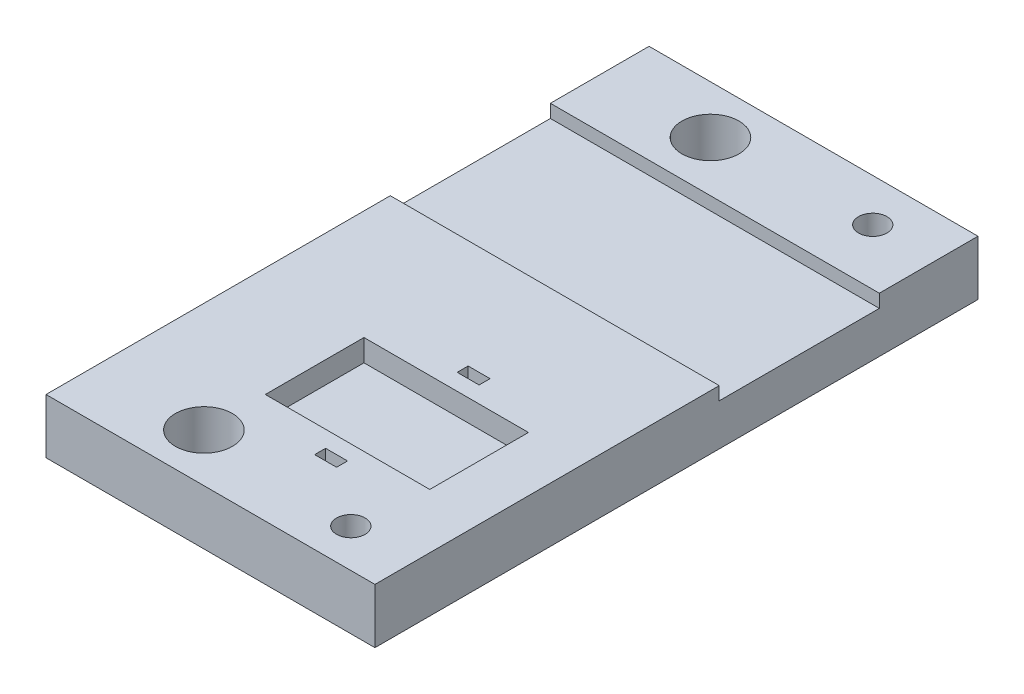
ISO-10303-21;
HEADER;
FILE_DESCRIPTION(('STEP AP214'),'2;1');
FILE_NAME('part.step','',(''),(''),'','','');
FILE_SCHEMA(('AUTOMOTIVE_DESIGN { 1 0 10303 214 1 1 1 1 }'));
ENDSEC;
DATA;
#1=APPLICATION_CONTEXT('core data for automotive mechanical design processes');
#2=APPLICATION_PROTOCOL_DEFINITION('international standard','automotive_design',2000,#1);
#3=PRODUCT_CONTEXT('',#1,'mechanical');
#4=PRODUCT('Part','Part','',(#3));
#5=PRODUCT_RELATED_PRODUCT_CATEGORY('part','',(#4));
#6=PRODUCT_DEFINITION_FORMATION('','',#4);
#7=PRODUCT_DEFINITION_CONTEXT('part definition',#1,'design');
#8=PRODUCT_DEFINITION('design','',#6,#7);
#9=PRODUCT_DEFINITION_SHAPE('','',#8);
#10=(LENGTH_UNIT() NAMED_UNIT(*) SI_UNIT(.MILLI.,.METRE.));
#11=(NAMED_UNIT(*) PLANE_ANGLE_UNIT() SI_UNIT($,.RADIAN.));
#12=(NAMED_UNIT(*) SI_UNIT($,.STERADIAN.) SOLID_ANGLE_UNIT());
#13=UNCERTAINTY_MEASURE_WITH_UNIT(LENGTH_MEASURE(1.E-05),#10,'distance_accuracy_value','');
#14=(GEOMETRIC_REPRESENTATION_CONTEXT(3) GLOBAL_UNCERTAINTY_ASSIGNED_CONTEXT((#13)) GLOBAL_UNIT_ASSIGNED_CONTEXT((#10,
#11,#12)) REPRESENTATION_CONTEXT('',''));
#15=CARTESIAN_POINT('',(0.,0.,0.));
#16=DIRECTION('',(0.,0.,1.));
#17=DIRECTION('',(1.,0.,0.));
#18=AXIS2_PLACEMENT_3D('',#15,#16,#17);
#19=CARTESIAN_POINT('',(0.,6.35,0.));
#20=DIRECTION('',(0.,1.,0.));
#21=DIRECTION('',(0.,0.,1.));
#22=AXIS2_PLACEMENT_3D('',#19,#20,#21);
#23=PLANE('',#22);
#24=DIRECTION('',(-1.,0.,0.));
#25=VECTOR('',#24,1.);
#26=CARTESIAN_POINT('',(-12.7,6.35,-52.832));
#27=LINE('',#26,#25);
#28=CARTESIAN_POINT('',(25.4,6.35,-52.832));
#29=VERTEX_POINT('',#28);
#30=CARTESIAN_POINT('',(-12.7,6.35,-52.832));
#31=VERTEX_POINT('',#30);
#32=EDGE_CURVE('E191',#29,#31,#27,.T.);
#33=ORIENTED_EDGE('',*,*,#32,.F.);
#34=DIRECTION('',(0.,0.,1.));
#35=VECTOR('',#34,1.);
#36=CARTESIAN_POINT('',(25.4,6.35,0.));
#37=LINE('',#36,#35);
#38=CARTESIAN_POINT('',(25.4,6.35,-64.262));
#39=VERTEX_POINT('',#38);
#40=EDGE_CURVE('E309',#39,#29,#37,.T.);
#41=ORIENTED_EDGE('',*,*,#40,.F.);
#42=DIRECTION('',(1.,0.,0.));
#43=VECTOR('',#42,1.);
#44=CARTESIAN_POINT('',(0.,6.35,-64.262));
#45=LINE('',#44,#43);
#46=CARTESIAN_POINT('',(-12.7,6.35,-64.262));
#47=VERTEX_POINT('',#46);
#48=EDGE_CURVE('E312',#47,#39,#45,.T.);
#49=ORIENTED_EDGE('',*,*,#48,.F.);
#50=DIRECTION('',(0.,0.,1.));
#51=VECTOR('',#50,1.);
#52=CARTESIAN_POINT('',(-12.7,6.35,0.));
#53=LINE('',#52,#51);
#54=EDGE_CURVE('E315',#47,#31,#53,.T.);
#55=ORIENTED_EDGE('',*,*,#54,.T.);
#56=EDGE_LOOP('',(#33,#41,#49,#55));
#57=FACE_BOUND('',#56,.T.);
#58=CARTESIAN_POINT('',(0.,6.35,-58.674));
#59=DIRECTION('',(0.,1.,0.));
#60=DIRECTION('',(0.,0.,1.));
#61=AXIS2_PLACEMENT_3D('',#58,#59,#60);
#62=CIRCLE('',#61,3.302);
#63=CARTESIAN_POINT('',(0.,6.35,-55.372));
#64=VERTEX_POINT('',#63);
#65=EDGE_CURVE('E302',#64,#64,#62,.T.);
#66=ORIENTED_EDGE('',*,*,#65,.F.);
#67=EDGE_LOOP('',(#66));
#68=FACE_BOUND('',#67,.T.);
#69=CARTESIAN_POINT('',(18.161,6.35,-59.309));
#70=DIRECTION('',(0.,1.,0.));
#71=DIRECTION('',(0.,0.,1.));
#72=AXIS2_PLACEMENT_3D('',#69,#70,#71);
#73=CIRCLE('',#72,1.651);
#74=CARTESIAN_POINT('',(18.161,6.35,-57.658));
#75=VERTEX_POINT('',#74);
#76=EDGE_CURVE('E298',#75,#75,#73,.T.);
#77=ORIENTED_EDGE('',*,*,#76,.F.);
#78=EDGE_LOOP('',(#77));
#79=FACE_BOUND('',#78,.T.);
#80=ADVANCED_FACE('F39',(#57,#68,#79),#23,.T.);
#81=CARTESIAN_POINT('',(8.89,0.,-5.20699999999998));
#82=DIRECTION('',(0.,0.,-1.));
#83=DIRECTION('',(-1.,0.,0.));
#84=AXIS2_PLACEMENT_3D('',#81,#82,#83);
#85=PLANE('',#84);
#86=DIRECTION('',(-1.,0.,0.));
#87=VECTOR('',#86,1.);
#88=CARTESIAN_POINT('',(8.89,1.016,-5.20699999999998));
#89=LINE('',#88,#87);
#90=CARTESIAN_POINT('',(11.43,1.016,-5.20699999999998));
#91=VERTEX_POINT('',#90);
#92=CARTESIAN_POINT('',(8.89,1.016,-5.20699999999998));
#93=VERTEX_POINT('',#92);
#94=EDGE_CURVE('E209',#91,#93,#89,.T.);
#95=ORIENTED_EDGE('',*,*,#94,.F.);
#96=DIRECTION('',(0.,1.,0.));
#97=VECTOR('',#96,1.);
#98=CARTESIAN_POINT('',(11.43,0.,-5.20699999999998));
#99=LINE('',#98,#97);
#100=CARTESIAN_POINT('',(11.43,6.35,-5.20699999999998));
#101=VERTEX_POINT('',#100);
#102=EDGE_CURVE('E239',#91,#101,#99,.T.);
#103=ORIENTED_EDGE('',*,*,#102,.T.);
#104=DIRECTION('',(-1.,0.,0.));
#105=VECTOR('',#104,1.);
#106=CARTESIAN_POINT('',(0.,6.35,-5.20699999999998));
#107=LINE('',#106,#105);
#108=CARTESIAN_POINT('',(8.89,6.35,-5.20699999999998));
#109=VERTEX_POINT('',#108);
#110=EDGE_CURVE('E244',#101,#109,#107,.T.);
#111=ORIENTED_EDGE('',*,*,#110,.T.);
#112=DIRECTION('',(0.,1.,0.));
#113=VECTOR('',#112,1.);
#114=CARTESIAN_POINT('',(8.89,0.,-5.20699999999998));
#115=LINE('',#114,#113);
#116=EDGE_CURVE('E237',#93,#109,#115,.T.);
#117=ORIENTED_EDGE('',*,*,#116,.F.);
#118=EDGE_LOOP('',(#95,#103,#111,#117));
#119=FACE_BOUND('',#118,.T.);
#120=ADVANCED_FACE('F379',(#119),#85,.F.);
#121=CARTESIAN_POINT('',(8.89,0.,-20.447));
#122=DIRECTION('',(0.,0.,1.));
#123=DIRECTION('',(1.,0.,0.));
#124=AXIS2_PLACEMENT_3D('',#121,#122,#123);
#125=PLANE('',#124);
#126=DIRECTION('',(1.,0.,0.));
#127=VECTOR('',#126,1.);
#128=CARTESIAN_POINT('',(8.89,1.016,-20.447));
#129=LINE('',#128,#127);
#130=CARTESIAN_POINT('',(8.89,1.016,-20.447));
#131=VERTEX_POINT('',#130);
#132=CARTESIAN_POINT('',(11.43,1.016,-20.447));
#133=VERTEX_POINT('',#132);
#134=EDGE_CURVE('E204',#131,#133,#129,.T.);
#135=ORIENTED_EDGE('',*,*,#134,.F.);
#136=DIRECTION('',(0.,1.,0.));
#137=VECTOR('',#136,1.);
#138=CARTESIAN_POINT('',(8.89,0.,-20.447));
#139=LINE('',#138,#137);
#140=CARTESIAN_POINT('',(8.89,6.35,-20.447));
#141=VERTEX_POINT('',#140);
#142=EDGE_CURVE('E221',#131,#141,#139,.T.);
#143=ORIENTED_EDGE('',*,*,#142,.T.);
#144=DIRECTION('',(1.,0.,0.));
#145=VECTOR('',#144,1.);
#146=CARTESIAN_POINT('',(0.,6.35,-20.447));
#147=LINE('',#146,#145);
#148=CARTESIAN_POINT('',(11.43,6.35,-20.447));
#149=VERTEX_POINT('',#148);
#150=EDGE_CURVE('E252',#141,#149,#147,.T.);
#151=ORIENTED_EDGE('',*,*,#150,.T.);
#152=DIRECTION('',(0.,1.,0.));
#153=VECTOR('',#152,1.);
#154=CARTESIAN_POINT('',(11.43,0.,-20.447));
#155=LINE('',#154,#153);
#156=EDGE_CURVE('E229',#133,#149,#155,.T.);
#157=ORIENTED_EDGE('',*,*,#156,.F.);
#158=EDGE_LOOP('',(#135,#143,#151,#157));
#159=FACE_BOUND('',#158,.T.);
#160=ADVANCED_FACE('F414',(#159),#125,.F.);
#161=CARTESIAN_POINT('',(25.4,6.35,0.));
#162=DIRECTION('',(1.,0.,0.));
#163=DIRECTION('',(0.,0.,-1.));
#164=AXIS2_PLACEMENT_3D('',#161,#162,#163);
#165=PLANE('',#164);
#166=DIRECTION('',(0.,1.,0.));
#167=VECTOR('',#166,1.);
#168=CARTESIAN_POINT('',(25.4,4.826,-52.832));
#169=LINE('',#168,#167);
#170=CARTESIAN_POINT('',(25.4,4.826,-52.832));
#171=VERTEX_POINT('',#170);
#172=EDGE_CURVE('E198',#171,#29,#169,.T.);
#173=ORIENTED_EDGE('',*,*,#172,.F.);
#174=DIRECTION('',(0.,0.,-1.));
#175=VECTOR('',#174,1.);
#176=CARTESIAN_POINT('',(25.4,4.826,-52.832));
#177=LINE('',#176,#175);
#178=CARTESIAN_POINT('',(25.4,4.826,-34.29));
#179=VERTEX_POINT('',#178);
#180=EDGE_CURVE('E181',#179,#171,#177,.T.);
#181=ORIENTED_EDGE('',*,*,#180,.F.);
#182=DIRECTION('',(0.,1.,0.));
#183=VECTOR('',#182,1.);
#184=CARTESIAN_POINT('',(25.4,4.826,-34.29));
#185=LINE('',#184,#183);
#186=CARTESIAN_POINT('',(25.4,6.35,-34.29));
#187=VERTEX_POINT('',#186);
#188=EDGE_CURVE('E178',#179,#187,#185,.T.);
#189=ORIENTED_EDGE('',*,*,#188,.T.);
#190=CARTESIAN_POINT('',(25.4,6.35,5.58800000000001));
#191=VERTEX_POINT('',#190);
#192=EDGE_CURVE('E308',#187,#191,#37,.T.);
#193=ORIENTED_EDGE('',*,*,#192,.T.);
#194=DIRECTION('',(0.,-1.,0.));
#195=VECTOR('',#194,1.);
#196=CARTESIAN_POINT('',(25.4,6.35,5.58800000000001));
#197=LINE('',#196,#195);
#198=CARTESIAN_POINT('',(25.4,0.,5.58800000000001));
#199=VERTEX_POINT('',#198);
#200=EDGE_CURVE('E321',#191,#199,#197,.T.);
#201=ORIENTED_EDGE('',*,*,#200,.T.);
#202=DIRECTION('',(0.,0.,1.));
#203=VECTOR('',#202,1.);
#204=CARTESIAN_POINT('',(25.4,0.,0.));
#205=LINE('',#204,#203);
#206=CARTESIAN_POINT('',(25.4,0.,-64.262));
#207=VERTEX_POINT('',#206);
#208=EDGE_CURVE('E333',#207,#199,#205,.T.);
#209=ORIENTED_EDGE('',*,*,#208,.F.);
#210=DIRECTION('',(0.,-1.,0.));
#211=VECTOR('',#210,1.);
#212=CARTESIAN_POINT('',(25.4,6.35,-64.262));
#213=LINE('',#212,#211);
#214=EDGE_CURVE('E11',#39,#207,#213,.T.);
#215=ORIENTED_EDGE('',*,*,#214,.F.);
#216=ORIENTED_EDGE('',*,*,#40,.T.);
#217=EDGE_LOOP('',(#173,#181,#189,#193,#201,#209,#215,#216));
#218=FACE_BOUND('',#217,.T.);
#219=ADVANCED_FACE('F359',(#218),#165,.T.);
#220=CARTESIAN_POINT('',(0.,6.35,-64.262));
#221=DIRECTION('',(0.,0.,-1.));
#222=DIRECTION('',(-1.,0.,0.));
#223=AXIS2_PLACEMENT_3D('',#220,#221,#222);
#224=PLANE('',#223);
#225=DIRECTION('',(1.,0.,0.));
#226=VECTOR('',#225,1.);
#227=CARTESIAN_POINT('',(0.,0.,-64.262));
#228=LINE('',#227,#226);
#229=CARTESIAN_POINT('',(-12.7,0.,-64.262));
#230=VERTEX_POINT('',#229);
#231=EDGE_CURVE('E336',#230,#207,#228,.T.);
#232=ORIENTED_EDGE('',*,*,#231,.F.);
#233=DIRECTION('',(0.,-1.,0.));
#234=VECTOR('',#233,1.);
#235=CARTESIAN_POINT('',(-12.7,6.35,-64.262));
#236=LINE('',#235,#234);
#237=EDGE_CURVE('E47',#47,#230,#236,.T.);
#238=ORIENTED_EDGE('',*,*,#237,.F.);
#239=ORIENTED_EDGE('',*,*,#48,.T.);
#240=ORIENTED_EDGE('',*,*,#214,.T.);
#241=EDGE_LOOP('',(#232,#238,#239,#240));
#242=FACE_BOUND('',#241,.T.);
#243=ADVANCED_FACE('F354',(#242),#224,.T.);
#244=CARTESIAN_POINT('',(-12.7,6.35,0.));
#245=DIRECTION('',(1.,0.,0.));
#246=DIRECTION('',(0.,0.,-1.));
#247=AXIS2_PLACEMENT_3D('',#244,#245,#246);
#248=PLANE('',#247);
#249=DIRECTION('',(0.,0.,1.));
#250=VECTOR('',#249,1.);
#251=CARTESIAN_POINT('',(-12.7,4.826,-52.832));
#252=LINE('',#251,#250);
#253=CARTESIAN_POINT('',(-12.7,4.826,-52.832));
#254=VERTEX_POINT('',#253);
#255=CARTESIAN_POINT('',(-12.7,4.826,-34.29));
#256=VERTEX_POINT('',#255);
#257=EDGE_CURVE('E182',#254,#256,#252,.T.);
#258=ORIENTED_EDGE('',*,*,#257,.F.);
#259=DIRECTION('',(0.,1.,0.));
#260=VECTOR('',#259,1.);
#261=CARTESIAN_POINT('',(-12.7,4.826,-52.832));
#262=LINE('',#261,#260);
#263=EDGE_CURVE('E205',#254,#31,#262,.T.);
#264=ORIENTED_EDGE('',*,*,#263,.T.);
#265=ORIENTED_EDGE('',*,*,#54,.F.);
#266=ORIENTED_EDGE('',*,*,#237,.T.);
#267=DIRECTION('',(0.,0.,1.));
#268=VECTOR('',#267,1.);
#269=CARTESIAN_POINT('',(-12.7,0.,0.));
#270=LINE('',#269,#268);
#271=CARTESIAN_POINT('',(-12.7,0.,5.58800000000001));
#272=VERTEX_POINT('',#271);
#273=EDGE_CURVE('E339',#230,#272,#270,.T.);
#274=ORIENTED_EDGE('',*,*,#273,.T.);
#275=DIRECTION('',(0.,-1.,0.));
#276=VECTOR('',#275,1.);
#277=CARTESIAN_POINT('',(-12.7,6.35,5.58800000000001));
#278=LINE('',#277,#276);
#279=CARTESIAN_POINT('',(-12.7,6.35,5.58800000000001));
#280=VERTEX_POINT('',#279);
#281=EDGE_CURVE('E345',#280,#272,#278,.T.);
#282=ORIENTED_EDGE('',*,*,#281,.F.);
#283=CARTESIAN_POINT('',(-12.7,6.35,-34.29));
#284=VERTEX_POINT('',#283);
#285=EDGE_CURVE('E196',#284,#280,#53,.T.);
#286=ORIENTED_EDGE('',*,*,#285,.F.);
#287=DIRECTION('',(0.,1.,0.));
#288=VECTOR('',#287,1.);
#289=CARTESIAN_POINT('',(-12.7,4.826,-34.29));
#290=LINE('',#289,#288);
#291=EDGE_CURVE('E54',#256,#284,#290,.T.);
#292=ORIENTED_EDGE('',*,*,#291,.F.);
#293=EDGE_LOOP('',(#258,#264,#265,#266,#274,#282,#286,#292));
#294=FACE_BOUND('',#293,.T.);
#295=ADVANCED_FACE('F194',(#294),#248,.F.);
#296=CARTESIAN_POINT('',(0.,6.35,0.));
#297=DIRECTION('',(0.,-1.,0.));
#298=DIRECTION('',(0.,0.,-1.));
#299=AXIS2_PLACEMENT_3D('',#296,#297,#298);
#300=CYLINDRICAL_SURFACE('',#299,3.302);
#301=CARTESIAN_POINT('',(0.,6.35,0.));
#302=DIRECTION('',(0.,1.,0.));
#303=DIRECTION('',(0.,0.,1.));
#304=AXIS2_PLACEMENT_3D('',#301,#302,#303);
#305=CIRCLE('',#304,3.302);
#306=CARTESIAN_POINT('',(0.,6.35,3.302));
#307=VERTEX_POINT('',#306);
#308=EDGE_CURVE('E305',#307,#307,#305,.T.);
#309=ORIENTED_EDGE('',*,*,#308,.T.);
#310=EDGE_LOOP('',(#309));
#311=FACE_BOUND('',#310,.T.);
#312=CARTESIAN_POINT('',(0.,0.,0.));
#313=DIRECTION('',(0.,1.,0.));
#314=DIRECTION('',(0.,0.,1.));
#315=AXIS2_PLACEMENT_3D('',#312,#313,#314);
#316=CIRCLE('',#315,3.302);
#317=CARTESIAN_POINT('',(0.,0.,3.302));
#318=VERTEX_POINT('',#317);
#319=EDGE_CURVE('E330',#318,#318,#316,.T.);
#320=ORIENTED_EDGE('',*,*,#319,.F.);
#321=EDGE_LOOP('',(#320));
#322=FACE_BOUND('',#321,.T.);
#323=ADVANCED_FACE('F400',(#311,#322),#300,.F.);
#324=CARTESIAN_POINT('',(0.,6.35,-58.674));
#325=DIRECTION('',(0.,-1.,0.));
#326=DIRECTION('',(0.,0.,-1.));
#327=AXIS2_PLACEMENT_3D('',#324,#325,#326);
#328=CYLINDRICAL_SURFACE('',#327,3.302);
#329=ORIENTED_EDGE('',*,*,#65,.T.);
#330=EDGE_LOOP('',(#329));
#331=FACE_BOUND('',#330,.T.);
#332=CARTESIAN_POINT('',(0.,0.,-58.674));
#333=DIRECTION('',(0.,1.,0.));
#334=DIRECTION('',(0.,0.,1.));
#335=AXIS2_PLACEMENT_3D('',#332,#333,#334);
#336=CIRCLE('',#335,3.302);
#337=CARTESIAN_POINT('',(0.,0.,-55.372));
#338=VERTEX_POINT('',#337);
#339=EDGE_CURVE('E327',#338,#338,#336,.T.);
#340=ORIENTED_EDGE('',*,*,#339,.F.);
#341=EDGE_LOOP('',(#340));
#342=FACE_BOUND('',#341,.T.);
#343=ADVANCED_FACE('F388',(#331,#342),#328,.F.);
#344=CARTESIAN_POINT('',(18.161,6.35,-59.309));
#345=DIRECTION('',(0.,-1.,0.));
#346=DIRECTION('',(0.,0.,-1.));
#347=AXIS2_PLACEMENT_3D('',#344,#345,#346);
#348=CYLINDRICAL_SURFACE('',#347,1.651);
#349=ORIENTED_EDGE('',*,*,#76,.T.);
#350=EDGE_LOOP('',(#349));
#351=FACE_BOUND('',#350,.T.);
#352=CARTESIAN_POINT('',(18.161,0.,-59.309));
#353=DIRECTION('',(0.,1.,0.));
#354=DIRECTION('',(0.,0.,1.));
#355=AXIS2_PLACEMENT_3D('',#352,#353,#354);
#356=CIRCLE('',#355,1.651);
#357=CARTESIAN_POINT('',(18.161,0.,-57.658));
#358=VERTEX_POINT('',#357);
#359=EDGE_CURVE('E324',#358,#358,#356,.T.);
#360=ORIENTED_EDGE('',*,*,#359,.F.);
#361=EDGE_LOOP('',(#360));
#362=FACE_BOUND('',#361,.T.);
#363=ADVANCED_FACE('F385',(#351,#362),#348,.F.);
#364=CARTESIAN_POINT('',(18.161,6.35,1.14300000000001));
#365=DIRECTION('',(0.,-1.,0.));
#366=DIRECTION('',(0.,0.,-1.));
#367=AXIS2_PLACEMENT_3D('',#364,#365,#366);
#368=CYLINDRICAL_SURFACE('',#367,1.651);
#369=CARTESIAN_POINT('',(18.161,6.35,1.14300000000001));
#370=DIRECTION('',(0.,1.,0.));
#371=DIRECTION('',(0.,0.,1.));
#372=AXIS2_PLACEMENT_3D('',#369,#370,#371);
#373=CIRCLE('',#372,1.651);
#374=CARTESIAN_POINT('',(18.161,6.35,2.79400000000001));
#375=VERTEX_POINT('',#374);
#376=EDGE_CURVE('E295',#375,#375,#373,.T.);
#377=ORIENTED_EDGE('',*,*,#376,.T.);
#378=EDGE_LOOP('',(#377));
#379=FACE_BOUND('',#378,.T.);
#380=CARTESIAN_POINT('',(18.161,0.,1.14300000000001));
#381=DIRECTION('',(0.,1.,0.));
#382=DIRECTION('',(0.,0.,1.));
#383=AXIS2_PLACEMENT_3D('',#380,#381,#382);
#384=CIRCLE('',#383,1.651);
#385=CARTESIAN_POINT('',(18.161,0.,2.79400000000001));
#386=VERTEX_POINT('',#385);
#387=EDGE_CURVE('E288',#386,#386,#384,.T.);
#388=ORIENTED_EDGE('',*,*,#387,.F.);
#389=EDGE_LOOP('',(#388));
#390=FACE_BOUND('',#389,.T.);
#391=ADVANCED_FACE('F41',(#379,#390),#368,.F.);
#392=CARTESIAN_POINT('',(0.,6.35,5.58800000000001));
#393=DIRECTION('',(0.,0.,-1.));
#394=DIRECTION('',(-1.,0.,0.));
#395=AXIS2_PLACEMENT_3D('',#392,#393,#394);
#396=PLANE('',#395);
#397=DIRECTION('',(1.,0.,0.));
#398=VECTOR('',#397,1.);
#399=CARTESIAN_POINT('',(0.,0.,5.58800000000001));
#400=LINE('',#399,#398);
#401=EDGE_CURVE('E299',#272,#199,#400,.T.);
#402=ORIENTED_EDGE('',*,*,#401,.T.);
#403=ORIENTED_EDGE('',*,*,#200,.F.);
#404=DIRECTION('',(1.,0.,0.));
#405=VECTOR('',#404,1.);
#406=CARTESIAN_POINT('',(0.,6.35,5.58800000000001));
#407=LINE('',#406,#405);
#408=EDGE_CURVE('E318',#280,#191,#407,.T.);
#409=ORIENTED_EDGE('',*,*,#408,.F.);
#410=ORIENTED_EDGE('',*,*,#281,.T.);
#411=EDGE_LOOP('',(#402,#403,#409,#410));
#412=FACE_BOUND('',#411,.T.);
#413=ADVANCED_FACE('F364',(#412),#396,.F.);
#414=DIRECTION('',(1.,0.,0.));
#415=VECTOR('',#414,1.);
#416=CARTESIAN_POINT('',(-12.7,6.35,-34.29));
#417=LINE('',#416,#415);
#418=EDGE_CURVE('E368',#284,#187,#417,.T.);
#419=ORIENTED_EDGE('',*,*,#418,.F.);
#420=ORIENTED_EDGE('',*,*,#285,.T.);
#421=ORIENTED_EDGE('',*,*,#408,.T.);
#422=ORIENTED_EDGE('',*,*,#192,.F.);
#423=EDGE_LOOP('',(#419,#420,#421,#422));
#424=FACE_BOUND('',#423,.T.);
#425=DIRECTION('',(0.,0.,1.));
#426=VECTOR('',#425,1.);
#427=CARTESIAN_POINT('',(8.89,6.35,0.));
#428=LINE('',#427,#426);
#429=CARTESIAN_POINT('',(8.89,6.35,-21.717));
#430=VERTEX_POINT('',#429);
#431=EDGE_CURVE('E259',#430,#141,#428,.T.);
#432=ORIENTED_EDGE('',*,*,#431,.F.);
#433=DIRECTION('',(-1.,0.,0.));
#434=VECTOR('',#433,1.);
#435=CARTESIAN_POINT('',(0.,6.35,-21.717));
#436=LINE('',#435,#434);
#437=CARTESIAN_POINT('',(11.43,6.35,-21.717));
#438=VERTEX_POINT('',#437);
#439=EDGE_CURVE('E257',#438,#430,#436,.T.);
#440=ORIENTED_EDGE('',*,*,#439,.F.);
#441=DIRECTION('',(0.,0.,-1.));
#442=VECTOR('',#441,1.);
#443=CARTESIAN_POINT('',(11.43,6.35,0.));
#444=LINE('',#443,#442);
#445=EDGE_CURVE('E255',#149,#438,#444,.T.);
#446=ORIENTED_EDGE('',*,*,#445,.F.);
#447=ORIENTED_EDGE('',*,*,#150,.F.);
#448=EDGE_LOOP('',(#432,#440,#446,#447));
#449=FACE_BOUND('',#448,.T.);
#450=DIRECTION('',(1.,0.,0.));
#451=VECTOR('',#450,1.);
#452=CARTESIAN_POINT('',(0.,6.35,-3.93699999999998));
#453=LINE('',#452,#451);
#454=CARTESIAN_POINT('',(8.89,6.35,-3.93699999999998));
#455=VERTEX_POINT('',#454);
#456=CARTESIAN_POINT('',(11.43,6.35,-3.93699999999998));
#457=VERTEX_POINT('',#456);
#458=EDGE_CURVE('E249',#455,#457,#453,.T.);
#459=ORIENTED_EDGE('',*,*,#458,.F.);
#460=DIRECTION('',(0.,0.,1.));
#461=VECTOR('',#460,1.);
#462=CARTESIAN_POINT('',(8.89,6.35,0.));
#463=LINE('',#462,#461);
#464=EDGE_CURVE('E247',#109,#455,#463,.T.);
#465=ORIENTED_EDGE('',*,*,#464,.F.);
#466=ORIENTED_EDGE('',*,*,#110,.F.);
#467=DIRECTION('',(0.,0.,-1.));
#468=VECTOR('',#467,1.);
#469=CARTESIAN_POINT('',(11.43,6.35,0.));
#470=LINE('',#469,#468);
#471=EDGE_CURVE('E225',#457,#101,#470,.T.);
#472=ORIENTED_EDGE('',*,*,#471,.F.);
#473=EDGE_LOOP('',(#459,#465,#466,#472));
#474=FACE_BOUND('',#473,.T.);
#475=DIRECTION('',(0.,0.,1.));
#476=VECTOR('',#475,1.);
#477=CARTESIAN_POINT('',(0.,6.35,-18.542));
#478=LINE('',#477,#476);
#479=CARTESIAN_POINT('',(0.,6.35,-18.542));
#480=VERTEX_POINT('',#479);
#481=CARTESIAN_POINT('',(0.,6.35,-7.11199999999998));
#482=VERTEX_POINT('',#481);
#483=EDGE_CURVE('E262',#480,#482,#478,.T.);
#484=ORIENTED_EDGE('',*,*,#483,.F.);
#485=DIRECTION('',(-1.,0.,0.));
#486=VECTOR('',#485,1.);
#487=CARTESIAN_POINT('',(0.,6.35,-18.542));
#488=LINE('',#487,#486);
#489=CARTESIAN_POINT('',(19.05,6.35,-18.542));
#490=VERTEX_POINT('',#489);
#491=EDGE_CURVE('E267',#490,#480,#488,.T.);
#492=ORIENTED_EDGE('',*,*,#491,.F.);
#493=DIRECTION('',(0.,0.,-1.));
#494=VECTOR('',#493,1.);
#495=CARTESIAN_POINT('',(19.05,6.35,-18.542));
#496=LINE('',#495,#494);
#497=CARTESIAN_POINT('',(19.05,6.35,-7.11199999999998));
#498=VERTEX_POINT('',#497);
#499=EDGE_CURVE('E281',#498,#490,#496,.T.);
#500=ORIENTED_EDGE('',*,*,#499,.F.);
#501=DIRECTION('',(1.,0.,0.));
#502=VECTOR('',#501,1.);
#503=CARTESIAN_POINT('',(0.,6.35,-7.11199999999998));
#504=LINE('',#503,#502);
#505=EDGE_CURVE('E278',#482,#498,#504,.T.);
#506=ORIENTED_EDGE('',*,*,#505,.F.);
#507=EDGE_LOOP('',(#484,#492,#500,#506));
#508=FACE_BOUND('',#507,.T.);
#509=ORIENTED_EDGE('',*,*,#376,.F.);
#510=EDGE_LOOP('',(#509));
#511=FACE_BOUND('',#510,.T.);
#512=ORIENTED_EDGE('',*,*,#308,.F.);
#513=EDGE_LOOP('',(#512));
#514=FACE_BOUND('',#513,.T.);
#515=ADVANCED_FACE('F366',(#424,#449,#474,#508,#511,#514),#23,.T.);
#516=CARTESIAN_POINT('',(0.,0.,0.));
#517=DIRECTION('',(0.,1.,0.));
#518=DIRECTION('',(0.,0.,1.));
#519=AXIS2_PLACEMENT_3D('',#516,#517,#518);
#520=PLANE('',#519);
#521=DIRECTION('',(0.,0.,1.));
#522=VECTOR('',#521,1.);
#523=CARTESIAN_POINT('',(8.89,0.,-20.447));
#524=LINE('',#523,#522);
#525=CARTESIAN_POINT('',(8.89,0.,-21.717));
#526=VERTEX_POINT('',#525);
#527=CARTESIAN_POINT('',(8.89,0.,-3.93699999999998));
#528=VERTEX_POINT('',#527);
#529=EDGE_CURVE('E212',#526,#528,#524,.T.);
#530=ORIENTED_EDGE('',*,*,#529,.T.);
#531=DIRECTION('',(1.,0.,0.));
#532=VECTOR('',#531,1.);
#533=CARTESIAN_POINT('',(8.89,0.,-3.93699999999998));
#534=LINE('',#533,#532);
#535=CARTESIAN_POINT('',(11.43,0.,-3.93699999999998));
#536=VERTEX_POINT('',#535);
#537=EDGE_CURVE('E211',#528,#536,#534,.T.);
#538=ORIENTED_EDGE('',*,*,#537,.T.);
#539=DIRECTION('',(0.,0.,-1.));
#540=VECTOR('',#539,1.);
#541=CARTESIAN_POINT('',(11.43,0.,-20.447));
#542=LINE('',#541,#540);
#543=CARTESIAN_POINT('',(11.43,0.,-21.717));
#544=VERTEX_POINT('',#543);
#545=EDGE_CURVE('E214',#536,#544,#542,.T.);
#546=ORIENTED_EDGE('',*,*,#545,.T.);
#547=DIRECTION('',(-1.,0.,0.));
#548=VECTOR('',#547,1.);
#549=CARTESIAN_POINT('',(8.89,0.,-21.717));
#550=LINE('',#549,#548);
#551=EDGE_CURVE('E218',#544,#526,#550,.T.);
#552=ORIENTED_EDGE('',*,*,#551,.T.);
#553=EDGE_LOOP('',(#530,#538,#546,#552));
#554=FACE_BOUND('',#553,.T.);
#555=ORIENTED_EDGE('',*,*,#387,.T.);
#556=EDGE_LOOP('',(#555));
#557=FACE_BOUND('',#556,.T.);
#558=ORIENTED_EDGE('',*,*,#359,.T.);
#559=EDGE_LOOP('',(#558));
#560=FACE_BOUND('',#559,.T.);
#561=ORIENTED_EDGE('',*,*,#339,.T.);
#562=EDGE_LOOP('',(#561));
#563=FACE_BOUND('',#562,.T.);
#564=ORIENTED_EDGE('',*,*,#319,.T.);
#565=EDGE_LOOP('',(#564));
#566=FACE_BOUND('',#565,.T.);
#567=ORIENTED_EDGE('',*,*,#208,.T.);
#568=ORIENTED_EDGE('',*,*,#401,.F.);
#569=ORIENTED_EDGE('',*,*,#273,.F.);
#570=ORIENTED_EDGE('',*,*,#231,.T.);
#571=EDGE_LOOP('',(#567,#568,#569,#570));
#572=FACE_BOUND('',#571,.T.);
#573=ADVANCED_FACE('F353',(#554,#557,#560,#563,#566,#572),#520,.F.);
#574=CARTESIAN_POINT('',(0.,3.81,-18.542));
#575=DIRECTION('',(-1.,0.,0.));
#576=DIRECTION('',(0.,0.,1.));
#577=AXIS2_PLACEMENT_3D('',#574,#575,#576);
#578=PLANE('',#577);
#579=ORIENTED_EDGE('',*,*,#483,.T.);
#580=DIRECTION('',(0.,1.,0.));
#581=VECTOR('',#580,1.);
#582=CARTESIAN_POINT('',(0.,3.81,-7.11199999999998));
#583=LINE('',#582,#581);
#584=CARTESIAN_POINT('',(0.,3.81,-7.11199999999998));
#585=VERTEX_POINT('',#584);
#586=EDGE_CURVE('E276',#585,#482,#583,.T.);
#587=ORIENTED_EDGE('',*,*,#586,.F.);
#588=DIRECTION('',(0.,0.,1.));
#589=VECTOR('',#588,1.);
#590=CARTESIAN_POINT('',(0.,3.81,-18.542));
#591=LINE('',#590,#589);
#592=CARTESIAN_POINT('',(0.,3.81,-18.542));
#593=VERTEX_POINT('',#592);
#594=EDGE_CURVE('E263',#593,#585,#591,.T.);
#595=ORIENTED_EDGE('',*,*,#594,.F.);
#596=DIRECTION('',(0.,1.,0.));
#597=VECTOR('',#596,1.);
#598=CARTESIAN_POINT('',(0.,3.81,-18.542));
#599=LINE('',#598,#597);
#600=EDGE_CURVE('E286',#593,#480,#599,.T.);
#601=ORIENTED_EDGE('',*,*,#600,.T.);
#602=EDGE_LOOP('',(#579,#587,#595,#601));
#603=FACE_BOUND('',#602,.T.);
#604=ADVANCED_FACE('F393',(#603),#578,.F.);
#605=CARTESIAN_POINT('',(0.,3.81,-18.542));
#606=DIRECTION('',(0.,0.,-1.));
#607=DIRECTION('',(-1.,0.,0.));
#608=AXIS2_PLACEMENT_3D('',#605,#606,#607);
#609=PLANE('',#608);
#610=ORIENTED_EDGE('',*,*,#491,.T.);
#611=ORIENTED_EDGE('',*,*,#600,.F.);
#612=DIRECTION('',(-1.,0.,0.));
#613=VECTOR('',#612,1.);
#614=CARTESIAN_POINT('',(0.,3.81,-18.542));
#615=LINE('',#614,#613);
#616=CARTESIAN_POINT('',(19.05,3.81,-18.542));
#617=VERTEX_POINT('',#616);
#618=EDGE_CURVE('E273',#617,#593,#615,.T.);
#619=ORIENTED_EDGE('',*,*,#618,.F.);
#620=DIRECTION('',(0.,1.,0.));
#621=VECTOR('',#620,1.);
#622=CARTESIAN_POINT('',(19.05,3.81,-18.542));
#623=LINE('',#622,#621);
#624=EDGE_CURVE('E289',#617,#490,#623,.T.);
#625=ORIENTED_EDGE('',*,*,#624,.T.);
#626=EDGE_LOOP('',(#610,#611,#619,#625));
#627=FACE_BOUND('',#626,.T.);
#628=ADVANCED_FACE('F422',(#627),#609,.F.);
#629=CARTESIAN_POINT('',(19.05,3.81,-18.542));
#630=DIRECTION('',(1.,0.,0.));
#631=DIRECTION('',(0.,0.,-1.));
#632=AXIS2_PLACEMENT_3D('',#629,#630,#631);
#633=PLANE('',#632);
#634=ORIENTED_EDGE('',*,*,#499,.T.);
#635=ORIENTED_EDGE('',*,*,#624,.F.);
#636=DIRECTION('',(0.,0.,-1.));
#637=VECTOR('',#636,1.);
#638=CARTESIAN_POINT('',(19.05,3.81,-18.542));
#639=LINE('',#638,#637);
#640=CARTESIAN_POINT('',(19.05,3.81,-7.11199999999998));
#641=VERTEX_POINT('',#640);
#642=EDGE_CURVE('E270',#641,#617,#639,.T.);
#643=ORIENTED_EDGE('',*,*,#642,.F.);
#644=DIRECTION('',(0.,1.,0.));
#645=VECTOR('',#644,1.);
#646=CARTESIAN_POINT('',(19.05,3.81,-7.11199999999998));
#647=LINE('',#646,#645);
#648=EDGE_CURVE('E291',#641,#498,#647,.T.);
#649=ORIENTED_EDGE('',*,*,#648,.T.);
#650=EDGE_LOOP('',(#634,#635,#643,#649));
#651=FACE_BOUND('',#650,.T.);
#652=ADVANCED_FACE('F428',(#651),#633,.F.);
#653=CARTESIAN_POINT('',(0.,3.81,-7.11199999999998));
#654=DIRECTION('',(0.,0.,1.));
#655=DIRECTION('',(1.,0.,0.));
#656=AXIS2_PLACEMENT_3D('',#653,#654,#655);
#657=PLANE('',#656);
#658=ORIENTED_EDGE('',*,*,#505,.T.);
#659=ORIENTED_EDGE('',*,*,#648,.F.);
#660=DIRECTION('',(1.,0.,0.));
#661=VECTOR('',#660,1.);
#662=CARTESIAN_POINT('',(0.,3.81,-7.11199999999998));
#663=LINE('',#662,#661);
#664=EDGE_CURVE('E266',#585,#641,#663,.T.);
#665=ORIENTED_EDGE('',*,*,#664,.F.);
#666=ORIENTED_EDGE('',*,*,#586,.T.);
#667=EDGE_LOOP('',(#658,#659,#665,#666));
#668=FACE_BOUND('',#667,.T.);
#669=ADVANCED_FACE('F424',(#668),#657,.F.);
#670=CARTESIAN_POINT('',(0.,3.81,0.));
#671=DIRECTION('',(0.,1.,0.));
#672=DIRECTION('',(0.,0.,1.));
#673=AXIS2_PLACEMENT_3D('',#670,#671,#672);
#674=PLANE('',#673);
#675=ORIENTED_EDGE('',*,*,#594,.T.);
#676=ORIENTED_EDGE('',*,*,#664,.T.);
#677=ORIENTED_EDGE('',*,*,#642,.T.);
#678=ORIENTED_EDGE('',*,*,#618,.T.);
#679=EDGE_LOOP('',(#675,#676,#677,#678));
#680=FACE_BOUND('',#679,.T.);
#681=ADVANCED_FACE('F427',(#680),#674,.T.);
#682=CARTESIAN_POINT('',(8.89,0.,-3.93699999999998));
#683=DIRECTION('',(0.,0.,1.));
#684=DIRECTION('',(1.,0.,0.));
#685=AXIS2_PLACEMENT_3D('',#682,#683,#684);
#686=PLANE('',#685);
#687=ORIENTED_EDGE('',*,*,#458,.T.);
#688=DIRECTION('',(0.,1.,0.));
#689=VECTOR('',#688,1.);
#690=CARTESIAN_POINT('',(11.43,0.,-3.93699999999998));
#691=LINE('',#690,#689);
#692=EDGE_CURVE('E234',#536,#457,#691,.T.);
#693=ORIENTED_EDGE('',*,*,#692,.F.);
#694=ORIENTED_EDGE('',*,*,#537,.F.);
#695=DIRECTION('',(0.,1.,0.));
#696=VECTOR('',#695,1.);
#697=CARTESIAN_POINT('',(8.89,0.,-3.93699999999998));
#698=LINE('',#697,#696);
#699=EDGE_CURVE('E215',#528,#455,#698,.T.);
#700=ORIENTED_EDGE('',*,*,#699,.T.);
#701=EDGE_LOOP('',(#687,#693,#694,#700));
#702=FACE_BOUND('',#701,.T.);
#703=ADVANCED_FACE('F438',(#702),#686,.F.);
#704=CARTESIAN_POINT('',(8.89,0.,-20.447));
#705=DIRECTION('',(-1.,0.,0.));
#706=DIRECTION('',(0.,0.,1.));
#707=AXIS2_PLACEMENT_3D('',#704,#705,#706);
#708=PLANE('',#707);
#709=ORIENTED_EDGE('',*,*,#431,.T.);
#710=ORIENTED_EDGE('',*,*,#142,.F.);
#711=DIRECTION('',(0.,0.,-1.));
#712=VECTOR('',#711,1.);
#713=CARTESIAN_POINT('',(8.89,1.016,-5.20699999999998));
#714=LINE('',#713,#712);
#715=EDGE_CURVE('E62',#93,#131,#714,.T.);
#716=ORIENTED_EDGE('',*,*,#715,.F.);
#717=ORIENTED_EDGE('',*,*,#116,.T.);
#718=ORIENTED_EDGE('',*,*,#464,.T.);
#719=ORIENTED_EDGE('',*,*,#699,.F.);
#720=ORIENTED_EDGE('',*,*,#529,.F.);
#721=DIRECTION('',(0.,1.,0.));
#722=VECTOR('',#721,1.);
#723=CARTESIAN_POINT('',(8.89,0.,-21.717));
#724=LINE('',#723,#722);
#725=EDGE_CURVE('E222',#526,#430,#724,.T.);
#726=ORIENTED_EDGE('',*,*,#725,.T.);
#727=EDGE_LOOP('',(#709,#710,#716,#717,#718,#719,#720,#726));
#728=FACE_BOUND('',#727,.T.);
#729=ADVANCED_FACE('F442',(#728),#708,.F.);
#730=CARTESIAN_POINT('',(8.89,0.,-21.717));
#731=DIRECTION('',(0.,0.,-1.));
#732=DIRECTION('',(-1.,0.,0.));
#733=AXIS2_PLACEMENT_3D('',#730,#731,#732);
#734=PLANE('',#733);
#735=ORIENTED_EDGE('',*,*,#439,.T.);
#736=ORIENTED_EDGE('',*,*,#725,.F.);
#737=ORIENTED_EDGE('',*,*,#551,.F.);
#738=DIRECTION('',(0.,1.,0.));
#739=VECTOR('',#738,1.);
#740=CARTESIAN_POINT('',(11.43,0.,-21.717));
#741=LINE('',#740,#739);
#742=EDGE_CURVE('E226',#544,#438,#741,.T.);
#743=ORIENTED_EDGE('',*,*,#742,.T.);
#744=EDGE_LOOP('',(#735,#736,#737,#743));
#745=FACE_BOUND('',#744,.T.);
#746=ADVANCED_FACE('F449',(#745),#734,.F.);
#747=CARTESIAN_POINT('',(11.43,0.,-20.447));
#748=DIRECTION('',(1.,0.,0.));
#749=DIRECTION('',(0.,0.,-1.));
#750=AXIS2_PLACEMENT_3D('',#747,#748,#749);
#751=PLANE('',#750);
#752=ORIENTED_EDGE('',*,*,#445,.T.);
#753=ORIENTED_EDGE('',*,*,#742,.F.);
#754=ORIENTED_EDGE('',*,*,#545,.F.);
#755=ORIENTED_EDGE('',*,*,#692,.T.);
#756=ORIENTED_EDGE('',*,*,#471,.T.);
#757=ORIENTED_EDGE('',*,*,#102,.F.);
#758=DIRECTION('',(0.,0.,1.));
#759=VECTOR('',#758,1.);
#760=CARTESIAN_POINT('',(11.43,1.016,-5.20699999999998));
#761=LINE('',#760,#759);
#762=EDGE_CURVE('E207',#133,#91,#761,.T.);
#763=ORIENTED_EDGE('',*,*,#762,.F.);
#764=ORIENTED_EDGE('',*,*,#156,.T.);
#765=EDGE_LOOP('',(#752,#753,#754,#755,#756,#757,#763,#764));
#766=FACE_BOUND('',#765,.T.);
#767=ADVANCED_FACE('F454',(#766),#751,.F.);
#768=CARTESIAN_POINT('',(0.,1.016,0.));
#769=DIRECTION('',(0.,-1.,0.));
#770=DIRECTION('',(0.,0.,-1.));
#771=AXIS2_PLACEMENT_3D('',#768,#769,#770);
#772=PLANE('',#771);
#773=ORIENTED_EDGE('',*,*,#715,.T.);
#774=ORIENTED_EDGE('',*,*,#134,.T.);
#775=ORIENTED_EDGE('',*,*,#762,.T.);
#776=ORIENTED_EDGE('',*,*,#94,.T.);
#777=EDGE_LOOP('',(#773,#774,#775,#776));
#778=FACE_BOUND('',#777,.T.);
#779=ADVANCED_FACE('F457',(#778),#772,.T.);
#780=CARTESIAN_POINT('',(-12.7,4.826,-52.832));
#781=DIRECTION('',(0.,0.,-1.));
#782=DIRECTION('',(-1.,0.,0.));
#783=AXIS2_PLACEMENT_3D('',#780,#781,#782);
#784=PLANE('',#783);
#785=ORIENTED_EDGE('',*,*,#32,.T.);
#786=ORIENTED_EDGE('',*,*,#263,.F.);
#787=DIRECTION('',(-1.,0.,0.));
#788=VECTOR('',#787,1.);
#789=CARTESIAN_POINT('',(-12.7,4.826,-52.832));
#790=LINE('',#789,#788);
#791=EDGE_CURVE('E188',#171,#254,#790,.T.);
#792=ORIENTED_EDGE('',*,*,#791,.F.);
#793=ORIENTED_EDGE('',*,*,#172,.T.);
#794=EDGE_LOOP('',(#785,#786,#792,#793));
#795=FACE_BOUND('',#794,.T.);
#796=ADVANCED_FACE('F375',(#795),#784,.F.);
#797=CARTESIAN_POINT('',(-12.7,4.826,-34.29));
#798=DIRECTION('',(0.,0.,1.));
#799=DIRECTION('',(1.,0.,0.));
#800=AXIS2_PLACEMENT_3D('',#797,#798,#799);
#801=PLANE('',#800);
#802=ORIENTED_EDGE('',*,*,#418,.T.);
#803=ORIENTED_EDGE('',*,*,#188,.F.);
#804=DIRECTION('',(1.,0.,0.));
#805=VECTOR('',#804,1.);
#806=CARTESIAN_POINT('',(-12.7,4.826,-34.29));
#807=LINE('',#806,#805);
#808=EDGE_CURVE('E174',#256,#179,#807,.T.);
#809=ORIENTED_EDGE('',*,*,#808,.F.);
#810=ORIENTED_EDGE('',*,*,#291,.T.);
#811=EDGE_LOOP('',(#802,#803,#809,#810));
#812=FACE_BOUND('',#811,.T.);
#813=ADVANCED_FACE('F176',(#812),#801,.F.);
#814=CARTESIAN_POINT('',(0.,4.826,0.));
#815=DIRECTION('',(0.,1.,0.));
#816=DIRECTION('',(0.,0.,1.));
#817=AXIS2_PLACEMENT_3D('',#814,#815,#816);
#818=PLANE('',#817);
#819=ORIENTED_EDGE('',*,*,#257,.T.);
#820=ORIENTED_EDGE('',*,*,#808,.T.);
#821=ORIENTED_EDGE('',*,*,#180,.T.);
#822=ORIENTED_EDGE('',*,*,#791,.T.);
#823=EDGE_LOOP('',(#819,#820,#821,#822));
#824=FACE_BOUND('',#823,.T.);
#825=ADVANCED_FACE('F186',(#824),#818,.T.);
#826=CLOSED_SHELL('',(#80,#120,#160,#219,#243,#295,#323,#343,#363,#391,#413,#515,#573,#604,#628,
#652,#669,#681,#703,#729,#746,#767,#779,#796,#813,#825));
#827=MANIFOLD_SOLID_BREP('B2',#826);
#828=ADVANCED_BREP_SHAPE_REPRESENTATION('',(#18,#827),#14);
#829=SHAPE_DEFINITION_REPRESENTATION(#9,#828);
ENDSEC;
END-ISO-10303-21;
